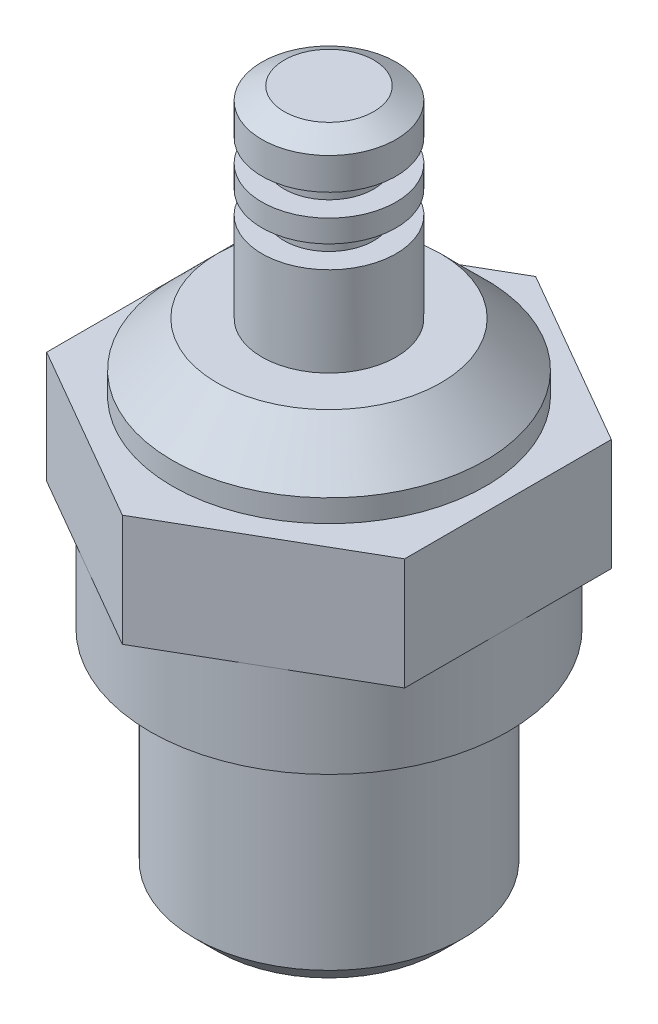
ISO-10303-21;
HEADER;
FILE_DESCRIPTION(('STEP AP214'),'2;1');
FILE_NAME('part.step','',(''),(''),'','','');
FILE_SCHEMA(('AUTOMOTIVE_DESIGN { 1 0 10303 214 1 1 1 1 }'));
ENDSEC;
DATA;
#1=APPLICATION_CONTEXT('core data for automotive mechanical design processes');
#2=APPLICATION_PROTOCOL_DEFINITION('international standard','automotive_design',2000,#1);
#3=PRODUCT_CONTEXT('',#1,'mechanical');
#4=PRODUCT('Part','Part','',(#3));
#5=PRODUCT_RELATED_PRODUCT_CATEGORY('part','',(#4));
#6=PRODUCT_DEFINITION_FORMATION('','',#4);
#7=PRODUCT_DEFINITION_CONTEXT('part definition',#1,'design');
#8=PRODUCT_DEFINITION('design','',#6,#7);
#9=PRODUCT_DEFINITION_SHAPE('','',#8);
#10=(LENGTH_UNIT() NAMED_UNIT(*) SI_UNIT(.MILLI.,.METRE.));
#11=(NAMED_UNIT(*) PLANE_ANGLE_UNIT() SI_UNIT($,.RADIAN.));
#12=(NAMED_UNIT(*) SI_UNIT($,.STERADIAN.) SOLID_ANGLE_UNIT());
#13=UNCERTAINTY_MEASURE_WITH_UNIT(LENGTH_MEASURE(1.E-05),#10,'distance_accuracy_value','');
#14=(GEOMETRIC_REPRESENTATION_CONTEXT(3) GLOBAL_UNCERTAINTY_ASSIGNED_CONTEXT((#13)) GLOBAL_UNIT_ASSIGNED_CONTEXT((#10,
#11,#12)) REPRESENTATION_CONTEXT('',''));
#15=CARTESIAN_POINT('',(0.,0.,0.));
#16=DIRECTION('',(0.,0.,1.));
#17=DIRECTION('',(1.,0.,0.));
#18=AXIS2_PLACEMENT_3D('',#15,#16,#17);
#19=CARTESIAN_POINT('',(0.,0.,0.));
#20=DIRECTION('',(0.,1.,0.));
#21=DIRECTION('',(0.,0.,1.));
#22=AXIS2_PLACEMENT_3D('',#19,#20,#21);
#23=PLANE('',#22);
#24=CARTESIAN_POINT('',(0.,0.,0.));
#25=DIRECTION('',(0.,-1.,0.));
#26=DIRECTION('',(0.,0.,-1.));
#27=AXIS2_PLACEMENT_3D('',#24,#25,#26);
#28=CIRCLE('',#27,4.);
#29=CARTESIAN_POINT('',(2.,0.,-3.46410161513775));
#30=VERTEX_POINT('',#29);
#31=CARTESIAN_POINT('',(4.,0.,0.));
#32=VERTEX_POINT('',#31);
#33=EDGE_CURVE('E138',#30,#32,#28,.T.);
#34=ORIENTED_EDGE('',*,*,#33,.F.);
#35=DIRECTION('',(-0.866025403784439,0.,-0.5));
#36=VECTOR('',#35,1.);
#37=CARTESIAN_POINT('',(4.,0.,-2.3094010767585));
#38=LINE('',#37,#36);
#39=CARTESIAN_POINT('',(4.,0.,-2.3094010767585));
#40=VERTEX_POINT('',#39);
#41=EDGE_CURVE('E115',#40,#30,#38,.T.);
#42=ORIENTED_EDGE('',*,*,#41,.F.);
#43=DIRECTION('',(0.,0.,-1.));
#44=VECTOR('',#43,1.);
#45=CARTESIAN_POINT('',(4.,0.,2.3094010767585));
#46=LINE('',#45,#44);
#47=EDGE_CURVE('E139',#32,#40,#46,.T.);
#48=ORIENTED_EDGE('',*,*,#47,.F.);
#49=EDGE_LOOP('',(#34,#42,#48));
#50=FACE_BOUND('',#49,.T.);
#51=ADVANCED_FACE('F41',(#50),#23,.F.);
#52=CARTESIAN_POINT('',(2.,0.,3.46410161513775));
#53=VERTEX_POINT('',#52);
#54=EDGE_CURVE('E146',#32,#53,#28,.T.);
#55=ORIENTED_EDGE('',*,*,#54,.F.);
#56=CARTESIAN_POINT('',(4.,0.,2.3094010767585));
#57=VERTEX_POINT('',#56);
#58=EDGE_CURVE('E136',#57,#32,#46,.T.);
#59=ORIENTED_EDGE('',*,*,#58,.F.);
#60=DIRECTION('',(0.866025403784439,0.,-0.5));
#61=VECTOR('',#60,1.);
#62=CARTESIAN_POINT('',(0.,0.,4.61880215351701));
#63=LINE('',#62,#61);
#64=EDGE_CURVE('E178',#53,#57,#63,.T.);
#65=ORIENTED_EDGE('',*,*,#64,.F.);
#66=EDGE_LOOP('',(#55,#59,#65));
#67=FACE_BOUND('',#66,.T.);
#68=ADVANCED_FACE('F220',(#67),#23,.F.);
#69=CARTESIAN_POINT('',(-2.,0.,3.46410161513775));
#70=VERTEX_POINT('',#69);
#71=EDGE_CURVE('E259',#53,#70,#28,.T.);
#72=ORIENTED_EDGE('',*,*,#71,.F.);
#73=CARTESIAN_POINT('',(0.,0.,4.61880215351701));
#74=VERTEX_POINT('',#73);
#75=EDGE_CURVE('E179',#74,#53,#63,.T.);
#76=ORIENTED_EDGE('',*,*,#75,.F.);
#77=DIRECTION('',(0.866025403784439,0.,0.5));
#78=VECTOR('',#77,1.);
#79=CARTESIAN_POINT('',(-4.,0.,2.3094010767585));
#80=LINE('',#79,#78);
#81=EDGE_CURVE('E174',#70,#74,#80,.T.);
#82=ORIENTED_EDGE('',*,*,#81,.F.);
#83=EDGE_LOOP('',(#72,#76,#82));
#84=FACE_BOUND('',#83,.T.);
#85=ADVANCED_FACE('F225',(#84),#23,.F.);
#86=CARTESIAN_POINT('',(-4.,0.,0.));
#87=VERTEX_POINT('',#86);
#88=EDGE_CURVE('E63',#70,#87,#28,.T.);
#89=ORIENTED_EDGE('',*,*,#88,.F.);
#90=CARTESIAN_POINT('',(-4.,0.,2.3094010767585));
#91=VERTEX_POINT('',#90);
#92=EDGE_CURVE('E175',#91,#70,#80,.T.);
#93=ORIENTED_EDGE('',*,*,#92,.F.);
#94=DIRECTION('',(0.,0.,1.));
#95=VECTOR('',#94,1.);
#96=CARTESIAN_POINT('',(-4.,0.,-2.3094010767585));
#97=LINE('',#96,#95);
#98=EDGE_CURVE('E169',#87,#91,#97,.T.);
#99=ORIENTED_EDGE('',*,*,#98,.F.);
#100=EDGE_LOOP('',(#89,#93,#99));
#101=FACE_BOUND('',#100,.T.);
#102=ADVANCED_FACE('F243',(#101),#23,.F.);
#103=CARTESIAN_POINT('',(-2.,0.,-3.46410161513776));
#104=VERTEX_POINT('',#103);
#105=EDGE_CURVE('E56',#87,#104,#28,.T.);
#106=ORIENTED_EDGE('',*,*,#105,.F.);
#107=CARTESIAN_POINT('',(-4.,0.,-2.3094010767585));
#108=VERTEX_POINT('',#107);
#109=EDGE_CURVE('E171',#108,#87,#97,.T.);
#110=ORIENTED_EDGE('',*,*,#109,.F.);
#111=DIRECTION('',(-0.866025403784439,0.,0.5));
#112=VECTOR('',#111,1.);
#113=CARTESIAN_POINT('',(0.,0.,-4.61880215351701));
#114=LINE('',#113,#112);
#115=EDGE_CURVE('E170',#104,#108,#114,.T.);
#116=ORIENTED_EDGE('',*,*,#115,.F.);
#117=EDGE_LOOP('',(#106,#110,#116));
#118=FACE_BOUND('',#117,.T.);
#119=ADVANCED_FACE('F231',(#118),#23,.F.);
#120=CARTESIAN_POINT('',(0.,2.5,-4.61880215351701));
#121=DIRECTION('',(0.5,0.,0.866025403784439));
#122=DIRECTION('',(0.866025403784439,0.,-0.5));
#123=AXIS2_PLACEMENT_3D('',#120,#121,#122);
#124=PLANE('',#123);
#125=CARTESIAN_POINT('',(0.,0.,-4.61880215351701));
#126=VERTEX_POINT('',#125);
#127=EDGE_CURVE('E135',#126,#104,#114,.T.);
#128=ORIENTED_EDGE('',*,*,#127,.T.);
#129=ORIENTED_EDGE('',*,*,#115,.T.);
#130=DIRECTION('',(0.,-1.,0.));
#131=VECTOR('',#130,1.);
#132=CARTESIAN_POINT('',(-4.,2.5,-2.3094010767585));
#133=LINE('',#132,#131);
#134=CARTESIAN_POINT('',(-4.,2.5,-2.3094010767585));
#135=VERTEX_POINT('',#134);
#136=EDGE_CURVE('E148',#135,#108,#133,.T.);
#137=ORIENTED_EDGE('',*,*,#136,.F.);
#138=DIRECTION('',(-0.866025403784439,0.,0.5));
#139=VECTOR('',#138,1.);
#140=CARTESIAN_POINT('',(0.,2.5,-4.61880215351701));
#141=LINE('',#140,#139);
#142=CARTESIAN_POINT('',(0.,2.5,-4.61880215351701));
#143=VERTEX_POINT('',#142);
#144=EDGE_CURVE('E127',#143,#135,#141,.T.);
#145=ORIENTED_EDGE('',*,*,#144,.F.);
#146=DIRECTION('',(0.,-1.,0.));
#147=VECTOR('',#146,1.);
#148=CARTESIAN_POINT('',(0.,2.5,-4.61880215351701));
#149=LINE('',#148,#147);
#150=EDGE_CURVE('E167',#143,#126,#149,.T.);
#151=ORIENTED_EDGE('',*,*,#150,.T.);
#152=EDGE_LOOP('',(#128,#129,#137,#145,#151));
#153=FACE_BOUND('',#152,.T.);
#154=ADVANCED_FACE('F242',(#153),#124,.F.);
#155=CARTESIAN_POINT('',(-4.,2.5,-2.3094010767585));
#156=DIRECTION('',(1.,0.,0.));
#157=DIRECTION('',(0.,0.,-1.));
#158=AXIS2_PLACEMENT_3D('',#155,#156,#157);
#159=PLANE('',#158);
#160=ORIENTED_EDGE('',*,*,#109,.T.);
#161=ORIENTED_EDGE('',*,*,#98,.T.);
#162=DIRECTION('',(0.,-1.,0.));
#163=VECTOR('',#162,1.);
#164=CARTESIAN_POINT('',(-4.,2.5,2.3094010767585));
#165=LINE('',#164,#163);
#166=CARTESIAN_POINT('',(-4.,2.5,2.3094010767585));
#167=VERTEX_POINT('',#166);
#168=EDGE_CURVE('E150',#167,#91,#165,.T.);
#169=ORIENTED_EDGE('',*,*,#168,.F.);
#170=DIRECTION('',(0.,0.,1.));
#171=VECTOR('',#170,1.);
#172=CARTESIAN_POINT('',(-4.,2.5,-2.3094010767585));
#173=LINE('',#172,#171);
#174=EDGE_CURVE('E157',#135,#167,#173,.T.);
#175=ORIENTED_EDGE('',*,*,#174,.F.);
#176=ORIENTED_EDGE('',*,*,#136,.T.);
#177=EDGE_LOOP('',(#160,#161,#169,#175,#176));
#178=FACE_BOUND('',#177,.T.);
#179=ADVANCED_FACE('F248',(#178),#159,.F.);
#180=CARTESIAN_POINT('',(-4.,2.5,2.3094010767585));
#181=DIRECTION('',(0.5,0.,-0.866025403784439));
#182=DIRECTION('',(-0.866025403784439,0.,-0.5));
#183=AXIS2_PLACEMENT_3D('',#180,#181,#182);
#184=PLANE('',#183);
#185=ORIENTED_EDGE('',*,*,#92,.T.);
#186=ORIENTED_EDGE('',*,*,#81,.T.);
#187=DIRECTION('',(0.,-1.,0.));
#188=VECTOR('',#187,1.);
#189=CARTESIAN_POINT('',(0.,2.5,4.61880215351701));
#190=LINE('',#189,#188);
#191=CARTESIAN_POINT('',(0.,2.5,4.61880215351701));
#192=VERTEX_POINT('',#191);
#193=EDGE_CURVE('E188',#192,#74,#190,.T.);
#194=ORIENTED_EDGE('',*,*,#193,.F.);
#195=DIRECTION('',(0.866025403784439,0.,0.5));
#196=VECTOR('',#195,1.);
#197=CARTESIAN_POINT('',(-4.,2.5,2.3094010767585));
#198=LINE('',#197,#196);
#199=EDGE_CURVE('E159',#167,#192,#198,.T.);
#200=ORIENTED_EDGE('',*,*,#199,.F.);
#201=ORIENTED_EDGE('',*,*,#168,.T.);
#202=EDGE_LOOP('',(#185,#186,#194,#200,#201));
#203=FACE_BOUND('',#202,.T.);
#204=ADVANCED_FACE('F269',(#203),#184,.F.);
#205=CARTESIAN_POINT('',(0.,2.5,4.61880215351701));
#206=DIRECTION('',(-0.5,0.,-0.866025403784438));
#207=DIRECTION('',(-0.866025403784438,0.,0.5));
#208=AXIS2_PLACEMENT_3D('',#205,#206,#207);
#209=PLANE('',#208);
#210=ORIENTED_EDGE('',*,*,#75,.T.);
#211=ORIENTED_EDGE('',*,*,#64,.T.);
#212=DIRECTION('',(0.,-1.,0.));
#213=VECTOR('',#212,1.);
#214=CARTESIAN_POINT('',(4.,2.5,2.3094010767585));
#215=LINE('',#214,#213);
#216=CARTESIAN_POINT('',(4.,2.5,2.3094010767585));
#217=VERTEX_POINT('',#216);
#218=EDGE_CURVE('E185',#217,#57,#215,.T.);
#219=ORIENTED_EDGE('',*,*,#218,.F.);
#220=DIRECTION('',(0.866025403784439,0.,-0.5));
#221=VECTOR('',#220,1.);
#222=CARTESIAN_POINT('',(0.,2.5,4.61880215351701));
#223=LINE('',#222,#221);
#224=EDGE_CURVE('E161',#192,#217,#223,.T.);
#225=ORIENTED_EDGE('',*,*,#224,.F.);
#226=ORIENTED_EDGE('',*,*,#193,.T.);
#227=EDGE_LOOP('',(#210,#211,#219,#225,#226));
#228=FACE_BOUND('',#227,.T.);
#229=ADVANCED_FACE('F264',(#228),#209,.F.);
#230=CARTESIAN_POINT('',(4.,2.5,2.3094010767585));
#231=DIRECTION('',(-1.,0.,0.));
#232=DIRECTION('',(0.,0.,1.));
#233=AXIS2_PLACEMENT_3D('',#230,#231,#232);
#234=PLANE('',#233);
#235=ORIENTED_EDGE('',*,*,#58,.T.);
#236=ORIENTED_EDGE('',*,*,#47,.T.);
#237=DIRECTION('',(0.,-1.,0.));
#238=VECTOR('',#237,1.);
#239=CARTESIAN_POINT('',(4.,2.5,-2.3094010767585));
#240=LINE('',#239,#238);
#241=CARTESIAN_POINT('',(4.,2.5,-2.3094010767585));
#242=VERTEX_POINT('',#241);
#243=EDGE_CURVE('E123',#242,#40,#240,.T.);
#244=ORIENTED_EDGE('',*,*,#243,.F.);
#245=DIRECTION('',(0.,0.,-1.));
#246=VECTOR('',#245,1.);
#247=CARTESIAN_POINT('',(4.,2.5,2.3094010767585));
#248=LINE('',#247,#246);
#249=EDGE_CURVE('E163',#217,#242,#248,.T.);
#250=ORIENTED_EDGE('',*,*,#249,.F.);
#251=ORIENTED_EDGE('',*,*,#218,.T.);
#252=EDGE_LOOP('',(#235,#236,#244,#250,#251));
#253=FACE_BOUND('',#252,.T.);
#254=ADVANCED_FACE('F277',(#253),#234,.F.);
#255=CARTESIAN_POINT('',(4.,2.5,-2.3094010767585));
#256=DIRECTION('',(-0.5,0.,0.866025403784439));
#257=DIRECTION('',(0.866025403784439,0.,0.5));
#258=AXIS2_PLACEMENT_3D('',#255,#256,#257);
#259=PLANE('',#258);
#260=ORIENTED_EDGE('',*,*,#41,.T.);
#261=EDGE_CURVE('E119',#30,#126,#38,.T.);
#262=ORIENTED_EDGE('',*,*,#261,.T.);
#263=ORIENTED_EDGE('',*,*,#150,.F.);
#264=DIRECTION('',(-0.866025403784439,0.,-0.5));
#265=VECTOR('',#264,1.);
#266=CARTESIAN_POINT('',(4.,2.5,-2.3094010767585));
#267=LINE('',#266,#265);
#268=EDGE_CURVE('E165',#242,#143,#267,.T.);
#269=ORIENTED_EDGE('',*,*,#268,.F.);
#270=ORIENTED_EDGE('',*,*,#243,.T.);
#271=EDGE_LOOP('',(#260,#262,#263,#269,#270));
#272=FACE_BOUND('',#271,.T.);
#273=ADVANCED_FACE('F117',(#272),#259,.F.);
#274=CARTESIAN_POINT('',(0.,2.5,0.));
#275=DIRECTION('',(0.,1.,0.));
#276=DIRECTION('',(0.,0.,1.));
#277=AXIS2_PLACEMENT_3D('',#274,#275,#276);
#278=PLANE('',#277);
#279=CARTESIAN_POINT('',(0.,2.5,0.));
#280=DIRECTION('',(0.,1.,0.));
#281=DIRECTION('',(0.,0.,1.));
#282=AXIS2_PLACEMENT_3D('',#279,#280,#281);
#283=CIRCLE('',#282,3.5);
#284=CARTESIAN_POINT('',(0.,2.5,3.5));
#285=VERTEX_POINT('',#284);
#286=EDGE_CURVE('E196',#285,#285,#283,.T.);
#287=ORIENTED_EDGE('',*,*,#286,.F.);
#288=EDGE_LOOP('',(#287));
#289=FACE_BOUND('',#288,.T.);
#290=ORIENTED_EDGE('',*,*,#144,.T.);
#291=ORIENTED_EDGE('',*,*,#174,.T.);
#292=ORIENTED_EDGE('',*,*,#199,.T.);
#293=ORIENTED_EDGE('',*,*,#224,.T.);
#294=ORIENTED_EDGE('',*,*,#249,.T.);
#295=ORIENTED_EDGE('',*,*,#268,.T.);
#296=EDGE_LOOP('',(#290,#291,#292,#293,#294,#295));
#297=FACE_BOUND('',#296,.T.);
#298=ADVANCED_FACE('F230',(#289,#297),#278,.T.);
#299=EDGE_CURVE('E133',#104,#30,#28,.T.);
#300=ORIENTED_EDGE('',*,*,#299,.F.);
#301=ORIENTED_EDGE('',*,*,#127,.F.);
#302=ORIENTED_EDGE('',*,*,#261,.F.);
#303=EDGE_LOOP('',(#300,#301,#302));
#304=FACE_BOUND('',#303,.T.);
#305=ADVANCED_FACE('F131',(#304),#23,.F.);
#306=CARTESIAN_POINT('',(0.,-2.,0.));
#307=DIRECTION('',(0.,1.,0.));
#308=DIRECTION('',(0.,0.,1.));
#309=AXIS2_PLACEMENT_3D('',#306,#307,#308);
#310=CYLINDRICAL_SURFACE('',#309,4.);
#311=CARTESIAN_POINT('',(0.,-2.,0.));
#312=DIRECTION('',(0.,-1.,0.));
#313=DIRECTION('',(0.,0.,-1.));
#314=AXIS2_PLACEMENT_3D('',#311,#312,#313);
#315=CIRCLE('',#314,4.);
#316=CARTESIAN_POINT('',(0.,-2.,-4.));
#317=VERTEX_POINT('',#316);
#318=EDGE_CURVE('E143',#317,#317,#315,.T.);
#319=ORIENTED_EDGE('',*,*,#318,.F.);
#320=EDGE_LOOP('',(#319));
#321=FACE_BOUND('',#320,.T.);
#322=ORIENTED_EDGE('',*,*,#33,.T.);
#323=ORIENTED_EDGE('',*,*,#54,.T.);
#324=ORIENTED_EDGE('',*,*,#71,.T.);
#325=ORIENTED_EDGE('',*,*,#88,.T.);
#326=ORIENTED_EDGE('',*,*,#105,.T.);
#327=ORIENTED_EDGE('',*,*,#299,.T.);
#328=EDGE_LOOP('',(#322,#323,#324,#325,#326,#327));
#329=FACE_BOUND('',#328,.T.);
#330=ADVANCED_FACE('F147',(#321,#329),#310,.T.);
#331=CARTESIAN_POINT('',(0.,-2.,0.));
#332=DIRECTION('',(0.,-1.,0.));
#333=DIRECTION('',(0.,0.,-1.));
#334=AXIS2_PLACEMENT_3D('',#331,#332,#333);
#335=PLANE('',#334);
#336=CARTESIAN_POINT('',(0.,-2.,0.));
#337=DIRECTION('',(0.,-1.,0.));
#338=DIRECTION('',(0.,0.,-1.));
#339=AXIS2_PLACEMENT_3D('',#336,#337,#338);
#340=CIRCLE('',#339,3.);
#341=CARTESIAN_POINT('',(0.,-2.,-3.));
#342=VERTEX_POINT('',#341);
#343=EDGE_CURVE('E144',#342,#342,#340,.T.);
#344=ORIENTED_EDGE('',*,*,#343,.F.);
#345=EDGE_LOOP('',(#344));
#346=FACE_BOUND('',#345,.T.);
#347=ORIENTED_EDGE('',*,*,#318,.T.);
#348=EDGE_LOOP('',(#347));
#349=FACE_BOUND('',#348,.T.);
#350=ADVANCED_FACE('F236',(#346,#349),#335,.T.);
#351=CARTESIAN_POINT('',(0.,-7.,0.));
#352=DIRECTION('',(0.,1.,0.));
#353=DIRECTION('',(0.,0.,1.));
#354=AXIS2_PLACEMENT_3D('',#351,#352,#353);
#355=CYLINDRICAL_SURFACE('',#354,3.);
#356=CARTESIAN_POINT('',(0.,-6.5,0.));
#357=DIRECTION('',(0.,-1.,0.));
#358=DIRECTION('',(0.,0.,-1.));
#359=AXIS2_PLACEMENT_3D('',#356,#357,#358);
#360=CIRCLE('',#359,3.);
#361=CARTESIAN_POINT('',(0.,-6.5,-3.));
#362=VERTEX_POINT('',#361);
#363=EDGE_CURVE('E11',#362,#362,#360,.F.);
#364=ORIENTED_EDGE('',*,*,#363,.T.);
#365=EDGE_LOOP('',(#364));
#366=FACE_BOUND('',#365,.T.);
#367=ORIENTED_EDGE('',*,*,#343,.T.);
#368=EDGE_LOOP('',(#367));
#369=FACE_BOUND('',#368,.T.);
#370=ADVANCED_FACE('F337',(#366,#369),#355,.T.);
#371=CARTESIAN_POINT('',(0.,-7.,0.));
#372=DIRECTION('',(0.,-1.,0.));
#373=DIRECTION('',(0.,0.,-1.));
#374=AXIS2_PLACEMENT_3D('',#371,#372,#373);
#375=PLANE('',#374);
#376=CARTESIAN_POINT('',(0.,-7.,0.));
#377=DIRECTION('',(0.,-1.,0.));
#378=DIRECTION('',(0.,0.,-1.));
#379=AXIS2_PLACEMENT_3D('',#376,#377,#378);
#380=CIRCLE('',#379,2.5);
#381=CARTESIAN_POINT('',(0.,-7.,-2.5));
#382=VERTEX_POINT('',#381);
#383=EDGE_CURVE('E49',#382,#382,#380,.T.);
#384=ORIENTED_EDGE('',*,*,#383,.T.);
#385=EDGE_LOOP('',(#384));
#386=FACE_BOUND('',#385,.T.);
#387=CARTESIAN_POINT('',(0.,-7.,0.));
#388=DIRECTION('',(0.,-1.,0.));
#389=DIRECTION('',(0.,0.,-1.));
#390=AXIS2_PLACEMENT_3D('',#387,#388,#389);
#391=CIRCLE('',#390,1.5);
#392=CARTESIAN_POINT('',(0.,-7.,-1.5));
#393=VERTEX_POINT('',#392);
#394=EDGE_CURVE('E512',#393,#393,#391,.T.);
#395=ORIENTED_EDGE('',*,*,#394,.F.);
#396=EDGE_LOOP('',(#395));
#397=FACE_BOUND('',#396,.T.);
#398=ADVANCED_FACE('F206',(#386,#397),#375,.T.);
#399=CARTESIAN_POINT('',(0.,-3.,0.));
#400=DIRECTION('',(0.,-1.,0.));
#401=DIRECTION('',(0.,0.,-1.));
#402=AXIS2_PLACEMENT_3D('',#399,#400,#401);
#403=CYLINDRICAL_SURFACE('',#402,1.5);
#404=CARTESIAN_POINT('',(0.,-3.,0.));
#405=DIRECTION('',(0.,-1.,0.));
#406=DIRECTION('',(0.,0.,-1.));
#407=AXIS2_PLACEMENT_3D('',#404,#405,#406);
#408=CIRCLE('',#407,1.5);
#409=CARTESIAN_POINT('',(0.,-3.,-1.5));
#410=VERTEX_POINT('',#409);
#411=EDGE_CURVE('E515',#410,#410,#408,.T.);
#412=ORIENTED_EDGE('',*,*,#411,.F.);
#413=EDGE_LOOP('',(#412));
#414=FACE_BOUND('',#413,.T.);
#415=ORIENTED_EDGE('',*,*,#394,.T.);
#416=EDGE_LOOP('',(#415));
#417=FACE_BOUND('',#416,.T.);
#418=ADVANCED_FACE('F352',(#414,#417),#403,.F.);
#419=CARTESIAN_POINT('',(0.,-3.,0.));
#420=DIRECTION('',(0.,-1.,0.));
#421=DIRECTION('',(0.,0.,-1.));
#422=AXIS2_PLACEMENT_3D('',#419,#420,#421);
#423=PLANE('',#422);
#424=ORIENTED_EDGE('',*,*,#411,.T.);
#425=EDGE_LOOP('',(#424));
#426=FACE_BOUND('',#425,.T.);
#427=ADVANCED_FACE('F358',(#426),#423,.T.);
#428=CARTESIAN_POINT('',(0.,3.,0.));
#429=DIRECTION('',(0.,-1.,0.));
#430=DIRECTION('',(0.,0.,-1.));
#431=AXIS2_PLACEMENT_3D('',#428,#429,#430);
#432=CYLINDRICAL_SURFACE('',#431,3.5);
#433=CARTESIAN_POINT('',(0.,3.,0.));
#434=DIRECTION('',(0.,1.,0.));
#435=DIRECTION('',(0.,0.,1.));
#436=AXIS2_PLACEMENT_3D('',#433,#434,#435);
#437=CIRCLE('',#436,3.5);
#438=CARTESIAN_POINT('',(0.,3.,3.5));
#439=VERTEX_POINT('',#438);
#440=EDGE_CURVE('E509',#439,#439,#437,.T.);
#441=ORIENTED_EDGE('',*,*,#440,.F.);
#442=EDGE_LOOP('',(#441));
#443=FACE_BOUND('',#442,.T.);
#444=ORIENTED_EDGE('',*,*,#286,.T.);
#445=EDGE_LOOP('',(#444));
#446=FACE_BOUND('',#445,.T.);
#447=ADVANCED_FACE('F365',(#443,#446),#432,.T.);
#448=CARTESIAN_POINT('',(0.,3.,0.));
#449=DIRECTION('',(0.,-1.,0.));
#450=DIRECTION('',(0.,0.,1.));
#451=AXIS2_PLACEMENT_3D('',#448,#449,#450);
#452=CONICAL_SURFACE('',#451,3.5,0.78539816339745);
#453=CARTESIAN_POINT('',(0.,4.,0.));
#454=DIRECTION('',(0.,1.,0.));
#455=DIRECTION('',(0.,0.,1.));
#456=AXIS2_PLACEMENT_3D('',#453,#454,#455);
#457=CIRCLE('',#456,2.5);
#458=CARTESIAN_POINT('',(0.,4.,2.5));
#459=VERTEX_POINT('',#458);
#460=EDGE_CURVE('E197',#459,#459,#457,.T.);
#461=ORIENTED_EDGE('',*,*,#460,.F.);
#462=EDGE_LOOP('',(#461));
#463=FACE_BOUND('',#462,.T.);
#464=ORIENTED_EDGE('',*,*,#440,.T.);
#465=EDGE_LOOP('',(#464));
#466=FACE_BOUND('',#465,.T.);
#467=ADVANCED_FACE('F387',(#463,#466),#452,.T.);
#468=CARTESIAN_POINT('',(0.,4.,0.));
#469=DIRECTION('',(0.,1.,0.));
#470=DIRECTION('',(0.,0.,1.));
#471=AXIS2_PLACEMENT_3D('',#468,#469,#470);
#472=PLANE('',#471);
#473=CARTESIAN_POINT('',(0.,4.,0.));
#474=DIRECTION('',(0.,1.,0.));
#475=DIRECTION('',(0.,0.,1.));
#476=AXIS2_PLACEMENT_3D('',#473,#474,#475);
#477=CIRCLE('',#476,1.5);
#478=CARTESIAN_POINT('',(0.,4.,1.5));
#479=VERTEX_POINT('',#478);
#480=EDGE_CURVE('E193',#479,#479,#477,.T.);
#481=ORIENTED_EDGE('',*,*,#480,.F.);
#482=EDGE_LOOP('',(#481));
#483=FACE_BOUND('',#482,.T.);
#484=ORIENTED_EDGE('',*,*,#460,.T.);
#485=EDGE_LOOP('',(#484));
#486=FACE_BOUND('',#485,.T.);
#487=ADVANCED_FACE('F376',(#483,#486),#472,.T.);
#488=CARTESIAN_POINT('',(0.,6.,0.));
#489=DIRECTION('',(0.,-1.,0.));
#490=DIRECTION('',(0.,0.,-1.));
#491=AXIS2_PLACEMENT_3D('',#488,#489,#490);
#492=CYLINDRICAL_SURFACE('',#491,1.5);
#493=CARTESIAN_POINT('',(0.,6.,0.));
#494=DIRECTION('',(0.,-1.,0.));
#495=DIRECTION('',(0.,0.,-1.));
#496=AXIS2_PLACEMENT_3D('',#493,#494,#495);
#497=CIRCLE('',#496,1.5);
#498=CARTESIAN_POINT('',(0.,6.,-1.5));
#499=VERTEX_POINT('',#498);
#500=EDGE_CURVE('E500',#499,#499,#497,.T.);
#501=ORIENTED_EDGE('',*,*,#500,.T.);
#502=EDGE_LOOP('',(#501));
#503=FACE_BOUND('',#502,.T.);
#504=ORIENTED_EDGE('',*,*,#480,.T.);
#505=EDGE_LOOP('',(#504));
#506=FACE_BOUND('',#505,.T.);
#507=ADVANCED_FACE('F369',(#503,#506),#492,.T.);
#508=CARTESIAN_POINT('',(0.,6.5,0.));
#509=DIRECTION('',(0.,-1.,0.));
#510=DIRECTION('',(0.,0.,-1.));
#511=AXIS2_PLACEMENT_3D('',#508,#509,#510);
#512=PLANE('',#511);
#513=CARTESIAN_POINT('',(0.,6.5,0.));
#514=DIRECTION('',(0.,-1.,0.));
#515=DIRECTION('',(0.,0.,-1.));
#516=AXIS2_PLACEMENT_3D('',#513,#514,#515);
#517=CIRCLE('',#516,1.);
#518=CARTESIAN_POINT('',(0.,6.5,-1.));
#519=VERTEX_POINT('',#518);
#520=EDGE_CURVE('E490',#519,#519,#517,.T.);
#521=ORIENTED_EDGE('',*,*,#520,.F.);
#522=EDGE_LOOP('',(#521));
#523=FACE_BOUND('',#522,.T.);
#524=CARTESIAN_POINT('',(0.,6.5,0.));
#525=DIRECTION('',(0.,-1.,0.));
#526=DIRECTION('',(0.,0.,-1.));
#527=AXIS2_PLACEMENT_3D('',#524,#525,#526);
#528=CIRCLE('',#527,1.5);
#529=CARTESIAN_POINT('',(0.,6.5,-1.5));
#530=VERTEX_POINT('',#529);
#531=EDGE_CURVE('E502',#530,#530,#528,.T.);
#532=ORIENTED_EDGE('',*,*,#531,.T.);
#533=EDGE_LOOP('',(#532));
#534=FACE_BOUND('',#533,.T.);
#535=ADVANCED_FACE('F375',(#523,#534),#512,.T.);
#536=CARTESIAN_POINT('',(0.,6.,0.));
#537=DIRECTION('',(0.,-1.,0.));
#538=DIRECTION('',(0.,0.,-1.));
#539=AXIS2_PLACEMENT_3D('',#536,#537,#538);
#540=PLANE('',#539);
#541=CARTESIAN_POINT('',(0.,6.,0.));
#542=DIRECTION('',(0.,-1.,0.));
#543=DIRECTION('',(0.,0.,-1.));
#544=AXIS2_PLACEMENT_3D('',#541,#542,#543);
#545=CIRCLE('',#544,1.);
#546=CARTESIAN_POINT('',(0.,6.,-1.));
#547=VERTEX_POINT('',#546);
#548=EDGE_CURVE('E486',#547,#547,#545,.T.);
#549=ORIENTED_EDGE('',*,*,#548,.T.);
#550=EDGE_LOOP('',(#549));
#551=FACE_BOUND('',#550,.T.);
#552=ORIENTED_EDGE('',*,*,#500,.F.);
#553=EDGE_LOOP('',(#552));
#554=FACE_BOUND('',#553,.T.);
#555=ADVANCED_FACE('F408',(#551,#554),#540,.F.);
#556=CARTESIAN_POINT('',(0.,6.5,0.));
#557=DIRECTION('',(0.,-1.,0.));
#558=DIRECTION('',(0.,0.,-1.));
#559=AXIS2_PLACEMENT_3D('',#556,#557,#558);
#560=CYLINDRICAL_SURFACE('',#559,1.);
#561=ORIENTED_EDGE('',*,*,#520,.T.);
#562=EDGE_LOOP('',(#561));
#563=FACE_BOUND('',#562,.T.);
#564=ORIENTED_EDGE('',*,*,#548,.F.);
#565=EDGE_LOOP('',(#564));
#566=FACE_BOUND('',#565,.T.);
#567=ADVANCED_FACE('F417',(#563,#566),#560,.T.);
#568=CARTESIAN_POINT('',(0.,7.,0.));
#569=DIRECTION('',(0.,-1.,0.));
#570=DIRECTION('',(0.,0.,-1.));
#571=AXIS2_PLACEMENT_3D('',#568,#569,#570);
#572=CIRCLE('',#571,1.5);
#573=CARTESIAN_POINT('',(0.,7.,-1.5));
#574=VERTEX_POINT('',#573);
#575=EDGE_CURVE('E487',#574,#574,#572,.T.);
#576=ORIENTED_EDGE('',*,*,#575,.T.);
#577=EDGE_LOOP('',(#576));
#578=FACE_BOUND('',#577,.T.);
#579=ORIENTED_EDGE('',*,*,#531,.F.);
#580=EDGE_LOOP('',(#579));
#581=FACE_BOUND('',#580,.T.);
#582=ADVANCED_FACE('F379',(#578,#581),#492,.T.);
#583=CARTESIAN_POINT('',(0.,7.5,0.));
#584=DIRECTION('',(0.,-1.,0.));
#585=DIRECTION('',(0.,0.,-1.));
#586=AXIS2_PLACEMENT_3D('',#583,#584,#585);
#587=PLANE('',#586);
#588=CARTESIAN_POINT('',(0.,7.5,0.));
#589=DIRECTION('',(0.,-1.,0.));
#590=DIRECTION('',(0.,0.,-1.));
#591=AXIS2_PLACEMENT_3D('',#588,#589,#590);
#592=CIRCLE('',#591,1.);
#593=CARTESIAN_POINT('',(0.,7.5,-1.));
#594=VERTEX_POINT('',#593);
#595=EDGE_CURVE('E493',#594,#594,#592,.T.);
#596=ORIENTED_EDGE('',*,*,#595,.F.);
#597=EDGE_LOOP('',(#596));
#598=FACE_BOUND('',#597,.T.);
#599=CARTESIAN_POINT('',(0.,7.5,0.));
#600=DIRECTION('',(0.,-1.,0.));
#601=DIRECTION('',(0.,0.,-1.));
#602=AXIS2_PLACEMENT_3D('',#599,#600,#601);
#603=CIRCLE('',#602,1.5);
#604=CARTESIAN_POINT('',(0.,7.5,-1.5));
#605=VERTEX_POINT('',#604);
#606=EDGE_CURVE('E484',#605,#605,#603,.T.);
#607=ORIENTED_EDGE('',*,*,#606,.T.);
#608=EDGE_LOOP('',(#607));
#609=FACE_BOUND('',#608,.T.);
#610=ADVANCED_FACE('F432',(#598,#609),#587,.T.);
#611=CARTESIAN_POINT('',(0.,7.,0.));
#612=DIRECTION('',(0.,-1.,0.));
#613=DIRECTION('',(0.,0.,-1.));
#614=AXIS2_PLACEMENT_3D('',#611,#612,#613);
#615=PLANE('',#614);
#616=CARTESIAN_POINT('',(0.,7.,0.));
#617=DIRECTION('',(0.,-1.,0.));
#618=DIRECTION('',(0.,0.,-1.));
#619=AXIS2_PLACEMENT_3D('',#616,#617,#618);
#620=CIRCLE('',#619,1.);
#621=CARTESIAN_POINT('',(0.,7.,-1.));
#622=VERTEX_POINT('',#621);
#623=EDGE_CURVE('E496',#622,#622,#620,.T.);
#624=ORIENTED_EDGE('',*,*,#623,.T.);
#625=EDGE_LOOP('',(#624));
#626=FACE_BOUND('',#625,.T.);
#627=ORIENTED_EDGE('',*,*,#575,.F.);
#628=EDGE_LOOP('',(#627));
#629=FACE_BOUND('',#628,.T.);
#630=ADVANCED_FACE('F440',(#626,#629),#615,.F.);
#631=CARTESIAN_POINT('',(0.,7.5,0.));
#632=DIRECTION('',(0.,-1.,0.));
#633=DIRECTION('',(0.,0.,-1.));
#634=AXIS2_PLACEMENT_3D('',#631,#632,#633);
#635=CYLINDRICAL_SURFACE('',#634,1.);
#636=ORIENTED_EDGE('',*,*,#595,.T.);
#637=EDGE_LOOP('',(#636));
#638=FACE_BOUND('',#637,.T.);
#639=ORIENTED_EDGE('',*,*,#623,.F.);
#640=EDGE_LOOP('',(#639));
#641=FACE_BOUND('',#640,.T.);
#642=ADVANCED_FACE('F449',(#638,#641),#635,.T.);
#643=CARTESIAN_POINT('',(0.,8.5,0.));
#644=DIRECTION('',(0.,-1.,0.));
#645=DIRECTION('',(0.,0.,-1.));
#646=AXIS2_PLACEMENT_3D('',#643,#644,#645);
#647=PLANE('',#646);
#648=CARTESIAN_POINT('',(0.,8.5,0.));
#649=DIRECTION('',(0.,-1.,0.));
#650=DIRECTION('',(0.,0.,-1.));
#651=AXIS2_PLACEMENT_3D('',#648,#649,#650);
#652=CIRCLE('',#651,0.999999999999994);
#653=CARTESIAN_POINT('',(0.,8.5,-0.999999999999994));
#654=VERTEX_POINT('',#653);
#655=EDGE_CURVE('E201',#654,#654,#652,.F.);
#656=ORIENTED_EDGE('',*,*,#655,.T.);
#657=EDGE_LOOP('',(#656));
#658=FACE_BOUND('',#657,.T.);
#659=ADVANCED_FACE('F457',(#658),#647,.F.);
#660=CARTESIAN_POINT('',(0.,8.21132486540519,0.));
#661=DIRECTION('',(0.,-1.,0.));
#662=DIRECTION('',(0.,0.,-1.));
#663=AXIS2_PLACEMENT_3D('',#660,#661,#662);
#664=CIRCLE('',#663,1.5);
#665=CARTESIAN_POINT('',(0.,8.21132486540519,-1.5));
#666=VERTEX_POINT('',#665);
#667=EDGE_CURVE('E198',#666,#666,#664,.T.);
#668=ORIENTED_EDGE('',*,*,#667,.T.);
#669=EDGE_LOOP('',(#668));
#670=FACE_BOUND('',#669,.T.);
#671=ORIENTED_EDGE('',*,*,#606,.F.);
#672=EDGE_LOOP('',(#671));
#673=FACE_BOUND('',#672,.T.);
#674=ADVANCED_FACE('F216',(#670,#673),#492,.T.);
#675=CARTESIAN_POINT('',(0.,8.21132486540519,0.));
#676=DIRECTION('',(0.,-1.,0.));
#677=DIRECTION('',(0.,0.,-1.));
#678=AXIS2_PLACEMENT_3D('',#675,#676,#677);
#679=CONICAL_SURFACE('',#678,1.5,1.0471975511966);
#680=ORIENTED_EDGE('',*,*,#655,.F.);
#681=EDGE_LOOP('',(#680));
#682=FACE_BOUND('',#681,.T.);
#683=ORIENTED_EDGE('',*,*,#667,.F.);
#684=EDGE_LOOP('',(#683));
#685=FACE_BOUND('',#684,.T.);
#686=ADVANCED_FACE('F210',(#682,#685),#679,.T.);
#687=CARTESIAN_POINT('',(0.,-7.,0.));
#688=DIRECTION('',(0.,1.,0.));
#689=DIRECTION('',(0.,0.,1.));
#690=AXIS2_PLACEMENT_3D('',#687,#688,#689);
#691=CONICAL_SURFACE('',#690,2.5,0.785398163397448);
#692=ORIENTED_EDGE('',*,*,#363,.F.);
#693=EDGE_LOOP('',(#692));
#694=FACE_BOUND('',#693,.T.);
#695=ORIENTED_EDGE('',*,*,#383,.F.);
#696=EDGE_LOOP('',(#695));
#697=FACE_BOUND('',#696,.T.);
#698=ADVANCED_FACE('F43',(#694,#697),#691,.T.);
#699=CLOSED_SHELL('',(#51,#68,#85,#102,#119,#154,#179,#204,#229,#254,#273,#298,#305,#330,#350,
#370,#398,#418,#427,#447,#467,#487,#507,#535,#555,#567,#582,#610,#630,#642,#659,#674,#686,#698));
#700=MANIFOLD_SOLID_BREP('B2',#699);
#701=ADVANCED_BREP_SHAPE_REPRESENTATION('',(#18,#700),#14);
#702=SHAPE_DEFINITION_REPRESENTATION(#9,#701);
ENDSEC;
END-ISO-10303-21;
